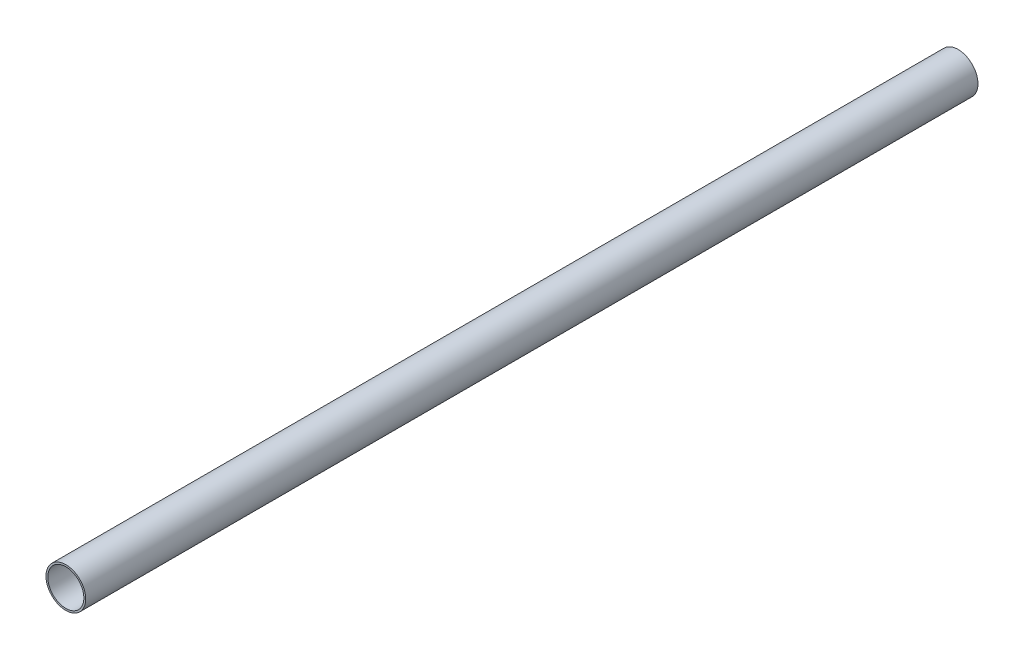
ISO-10303-21;
HEADER;
FILE_DESCRIPTION(('STEP AP214'),'2;1');
FILE_NAME('part.step','',(''),(''),'','','');
FILE_SCHEMA(('AUTOMOTIVE_DESIGN { 1 0 10303 214 1 1 1 1 }'));
ENDSEC;
DATA;
#1=APPLICATION_CONTEXT('core data for automotive mechanical design processes');
#2=APPLICATION_PROTOCOL_DEFINITION('international standard','automotive_design',2000,#1);
#3=PRODUCT_CONTEXT('',#1,'mechanical');
#4=PRODUCT('Part','Part','',(#3));
#5=PRODUCT_RELATED_PRODUCT_CATEGORY('part','',(#4));
#6=PRODUCT_DEFINITION_FORMATION('','',#4);
#7=PRODUCT_DEFINITION_CONTEXT('part definition',#1,'design');
#8=PRODUCT_DEFINITION('design','',#6,#7);
#9=PRODUCT_DEFINITION_SHAPE('','',#8);
#10=(LENGTH_UNIT() NAMED_UNIT(*) SI_UNIT(.MILLI.,.METRE.));
#11=(NAMED_UNIT(*) PLANE_ANGLE_UNIT() SI_UNIT($,.RADIAN.));
#12=(NAMED_UNIT(*) SI_UNIT($,.STERADIAN.) SOLID_ANGLE_UNIT());
#13=UNCERTAINTY_MEASURE_WITH_UNIT(LENGTH_MEASURE(1.E-05),#10,'distance_accuracy_value','');
#14=(GEOMETRIC_REPRESENTATION_CONTEXT(3) GLOBAL_UNCERTAINTY_ASSIGNED_CONTEXT((#13)) GLOBAL_UNIT_ASSIGNED_CONTEXT((#10,
#11,#12)) REPRESENTATION_CONTEXT('',''));
#15=CARTESIAN_POINT('',(0.,0.,0.));
#16=DIRECTION('',(0.,0.,1.));
#17=DIRECTION('',(1.,0.,0.));
#18=AXIS2_PLACEMENT_3D('',#15,#16,#17);
#19=CARTESIAN_POINT('',(2675.10583961434,3025.34596438199,-174.625));
#20=DIRECTION('',(0.,0.,-1.));
#21=DIRECTION('',(1.,0.,0.));
#22=AXIS2_PLACEMENT_3D('',#19,#20,#21);
#23=PLANE('',#22);
#24=CARTESIAN_POINT('',(2675.10583961434,3025.34596438199,-174.625));
#25=DIRECTION('',(0.,0.,1.));
#26=DIRECTION('',(1.,0.,0.));
#27=AXIS2_PLACEMENT_3D('',#24,#25,#26);
#28=CIRCLE('',#27,3.88620000000017);
#29=CARTESIAN_POINT('',(2678.99203961434,3025.34596438199,-174.625));
#30=VERTEX_POINT('',#29);
#31=EDGE_CURVE('E10',#30,#30,#28,.T.);
#32=ORIENTED_EDGE('',*,*,#31,.F.);
#33=EDGE_LOOP('',(#32));
#34=FACE_BOUND('',#33,.T.);
#35=CARTESIAN_POINT('',(2675.10583961434,3025.34596438199,-174.625));
#36=DIRECTION('',(0.,0.,1.));
#37=DIRECTION('',(1.,0.,0.));
#38=AXIS2_PLACEMENT_3D('',#35,#36,#37);
#39=CIRCLE('',#38,3.53059999999994);
#40=CARTESIAN_POINT('',(2678.63643961434,3025.34596438199,-174.625));
#41=VERTEX_POINT('',#40);
#42=EDGE_CURVE('E41',#41,#41,#39,.T.);
#43=ORIENTED_EDGE('',*,*,#42,.T.);
#44=EDGE_LOOP('',(#43));
#45=FACE_BOUND('',#44,.T.);
#46=ADVANCED_FACE('F30',(#34,#45),#23,.T.);
#47=CARTESIAN_POINT('',(2675.10583961434,3025.34596438199,0.));
#48=DIRECTION('',(0.,0.,-1.));
#49=DIRECTION('',(1.,0.,0.));
#50=AXIS2_PLACEMENT_3D('',#47,#48,#49);
#51=PLANE('',#50);
#52=CARTESIAN_POINT('',(2675.10583961434,3025.34596438199,0.));
#53=DIRECTION('',(0.,0.,1.));
#54=DIRECTION('',(1.,0.,0.));
#55=AXIS2_PLACEMENT_3D('',#52,#53,#54);
#56=CIRCLE('',#55,3.88620000000017);
#57=CARTESIAN_POINT('',(2678.99203961434,3025.34596438199,0.));
#58=VERTEX_POINT('',#57);
#59=EDGE_CURVE('E34',#58,#58,#56,.T.);
#60=ORIENTED_EDGE('',*,*,#59,.T.);
#61=EDGE_LOOP('',(#60));
#62=FACE_BOUND('',#61,.T.);
#63=CARTESIAN_POINT('',(2675.10583961434,3025.34596438199,0.));
#64=DIRECTION('',(0.,0.,1.));
#65=DIRECTION('',(1.,0.,0.));
#66=AXIS2_PLACEMENT_3D('',#63,#64,#65);
#67=CIRCLE('',#66,3.53059999999994);
#68=CARTESIAN_POINT('',(2678.63643961434,3025.34596438199,0.));
#69=VERTEX_POINT('',#68);
#70=EDGE_CURVE('E43',#69,#69,#67,.T.);
#71=ORIENTED_EDGE('',*,*,#70,.F.);
#72=EDGE_LOOP('',(#71));
#73=FACE_BOUND('',#72,.T.);
#74=ADVANCED_FACE('F56',(#62,#73),#51,.F.);
#75=CARTESIAN_POINT('',(2675.10583961434,3025.34596438199,-174.625));
#76=DIRECTION('',(0.,0.,1.));
#77=DIRECTION('',(-1.,0.,0.));
#78=AXIS2_PLACEMENT_3D('',#75,#76,#77);
#79=CYLINDRICAL_SURFACE('',#78,3.88620000000017);
#80=ORIENTED_EDGE('',*,*,#31,.T.);
#81=EDGE_LOOP('',(#80));
#82=FACE_BOUND('',#81,.T.);
#83=ORIENTED_EDGE('',*,*,#59,.F.);
#84=EDGE_LOOP('',(#83));
#85=FACE_BOUND('',#84,.T.);
#86=ADVANCED_FACE('F32',(#82,#85),#79,.T.);
#87=CARTESIAN_POINT('',(2675.10583961434,3025.34596438199,-174.625));
#88=DIRECTION('',(0.,0.,1.));
#89=DIRECTION('',(-1.,0.,0.));
#90=AXIS2_PLACEMENT_3D('',#87,#88,#89);
#91=CYLINDRICAL_SURFACE('',#90,3.53059999999994);
#92=ORIENTED_EDGE('',*,*,#42,.F.);
#93=EDGE_LOOP('',(#92));
#94=FACE_BOUND('',#93,.T.);
#95=ORIENTED_EDGE('',*,*,#70,.T.);
#96=EDGE_LOOP('',(#95));
#97=FACE_BOUND('',#96,.T.);
#98=ADVANCED_FACE('F50',(#94,#97),#91,.F.);
#99=CLOSED_SHELL('',(#46,#74,#86,#98));
#100=MANIFOLD_SOLID_BREP('B2',#99);
#101=ADVANCED_BREP_SHAPE_REPRESENTATION('',(#18,#100),#14);
#102=SHAPE_DEFINITION_REPRESENTATION(#9,#101);
ENDSEC;
END-ISO-10303-21;
